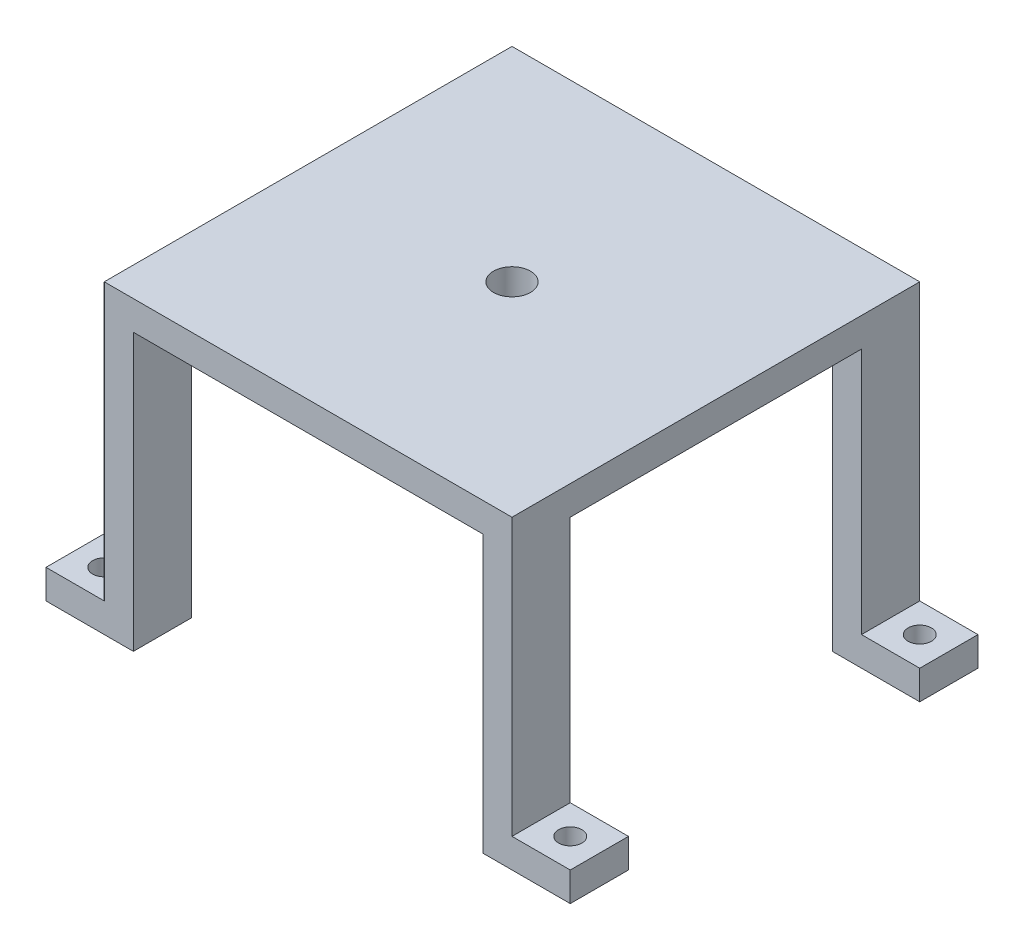
ISO-10303-21;
HEADER;
FILE_DESCRIPTION(('STEP AP214'),'2;1');
FILE_NAME('part.step','',(''),(''),'','','');
FILE_SCHEMA(('AUTOMOTIVE_DESIGN { 1 0 10303 214 1 1 1 1 }'));
ENDSEC;
DATA;
#1=APPLICATION_CONTEXT('core data for automotive mechanical design processes');
#2=APPLICATION_PROTOCOL_DEFINITION('international standard','automotive_design',2000,#1);
#3=PRODUCT_CONTEXT('',#1,'mechanical');
#4=PRODUCT('Part','Part','',(#3));
#5=PRODUCT_RELATED_PRODUCT_CATEGORY('part','',(#4));
#6=PRODUCT_DEFINITION_FORMATION('','',#4);
#7=PRODUCT_DEFINITION_CONTEXT('part definition',#1,'design');
#8=PRODUCT_DEFINITION('design','',#6,#7);
#9=PRODUCT_DEFINITION_SHAPE('','',#8);
#10=(LENGTH_UNIT() NAMED_UNIT(*) SI_UNIT(.MILLI.,.METRE.));
#11=(NAMED_UNIT(*) PLANE_ANGLE_UNIT() SI_UNIT($,.RADIAN.));
#12=(NAMED_UNIT(*) SI_UNIT($,.STERADIAN.) SOLID_ANGLE_UNIT());
#13=UNCERTAINTY_MEASURE_WITH_UNIT(LENGTH_MEASURE(1.E-05),#10,'distance_accuracy_value','');
#14=(GEOMETRIC_REPRESENTATION_CONTEXT(3) GLOBAL_UNCERTAINTY_ASSIGNED_CONTEXT((#13)) GLOBAL_UNIT_ASSIGNED_CONTEXT((#10,
#11,#12)) REPRESENTATION_CONTEXT('',''));
#15=CARTESIAN_POINT('',(0.,0.,0.));
#16=DIRECTION('',(0.,0.,1.));
#17=DIRECTION('',(1.,0.,0.));
#18=AXIS2_PLACEMENT_3D('',#15,#16,#17);
#19=CARTESIAN_POINT('',(0.,0.,0.));
#20=DIRECTION('',(0.,-1.,0.));
#21=DIRECTION('',(0.,0.,-1.));
#22=AXIS2_PLACEMENT_3D('',#19,#20,#21);
#23=PLANE('',#22);
#24=DIRECTION('',(0.,0.,-1.));
#25=VECTOR('',#24,1.);
#26=CARTESIAN_POINT('',(30.,0.,175.039070998954));
#27=LINE('',#26,#25);
#28=CARTESIAN_POINT('',(30.,0.,35.));
#29=VERTEX_POINT('',#28);
#30=CARTESIAN_POINT('',(30.,0.,25.));
#31=VERTEX_POINT('',#30);
#32=EDGE_CURVE('E437',#29,#31,#27,.T.);
#33=ORIENTED_EDGE('',*,*,#32,.T.);
#34=DIRECTION('',(-1.,0.,0.));
#35=VECTOR('',#34,1.);
#36=CARTESIAN_POINT('',(35.,0.,25.));
#37=LINE('',#36,#35);
#38=CARTESIAN_POINT('',(45.,0.,25.));
#39=VERTEX_POINT('',#38);
#40=EDGE_CURVE('E394',#39,#31,#37,.T.);
#41=ORIENTED_EDGE('',*,*,#40,.F.);
#42=DIRECTION('',(0.,0.,-1.));
#43=VECTOR('',#42,1.);
#44=CARTESIAN_POINT('',(45.,0.,35.));
#45=LINE('',#44,#43);
#46=CARTESIAN_POINT('',(45.,0.,35.));
#47=VERTEX_POINT('',#46);
#48=EDGE_CURVE('E385',#47,#39,#45,.T.);
#49=ORIENTED_EDGE('',*,*,#48,.F.);
#50=DIRECTION('',(1.,0.,0.));
#51=VECTOR('',#50,1.);
#52=CARTESIAN_POINT('',(-35.,0.,35.));
#53=LINE('',#52,#51);
#54=EDGE_CURVE('E455',#29,#47,#53,.T.);
#55=ORIENTED_EDGE('',*,*,#54,.F.);
#56=EDGE_LOOP('',(#33,#41,#49,#55));
#57=FACE_BOUND('',#56,.T.);
#58=CARTESIAN_POINT('',(40.,0.,30.));
#59=DIRECTION('',(0.,1.,0.));
#60=DIRECTION('',(0.,0.,1.));
#61=AXIS2_PLACEMENT_3D('',#58,#59,#60);
#62=CIRCLE('',#61,2.);
#63=CARTESIAN_POINT('',(40.,0.,32.));
#64=VERTEX_POINT('',#63);
#65=EDGE_CURVE('E342',#64,#64,#62,.T.);
#66=ORIENTED_EDGE('',*,*,#65,.T.);
#67=EDGE_LOOP('',(#66));
#68=FACE_BOUND('',#67,.T.);
#69=ADVANCED_FACE('F45',(#57,#68),#23,.T.);
#70=DIRECTION('',(-1.,0.,0.));
#71=VECTOR('',#70,1.);
#72=CARTESIAN_POINT('',(-35.,0.,25.));
#73=LINE('',#72,#71);
#74=CARTESIAN_POINT('',(-30.,0.,25.));
#75=VERTEX_POINT('',#74);
#76=CARTESIAN_POINT('',(-45.,0.,25.));
#77=VERTEX_POINT('',#76);
#78=EDGE_CURVE('E358',#75,#77,#73,.T.);
#79=ORIENTED_EDGE('',*,*,#78,.F.);
#80=DIRECTION('',(0.,0.,-1.));
#81=VECTOR('',#80,1.);
#82=CARTESIAN_POINT('',(-30.,0.,175.039070998954));
#83=LINE('',#82,#81);
#84=CARTESIAN_POINT('',(-30.,0.,35.));
#85=VERTEX_POINT('',#84);
#86=EDGE_CURVE('E446',#85,#75,#83,.T.);
#87=ORIENTED_EDGE('',*,*,#86,.F.);
#88=CARTESIAN_POINT('',(-45.,0.,35.));
#89=VERTEX_POINT('',#88);
#90=EDGE_CURVE('E471',#89,#85,#53,.T.);
#91=ORIENTED_EDGE('',*,*,#90,.F.);
#92=DIRECTION('',(0.,0.,1.));
#93=VECTOR('',#92,1.);
#94=CARTESIAN_POINT('',(-45.,0.,35.));
#95=LINE('',#94,#93);
#96=EDGE_CURVE('E354',#77,#89,#95,.T.);
#97=ORIENTED_EDGE('',*,*,#96,.F.);
#98=EDGE_LOOP('',(#79,#87,#91,#97));
#99=FACE_BOUND('',#98,.T.);
#100=CARTESIAN_POINT('',(-40.,0.,30.));
#101=DIRECTION('',(0.,1.,0.));
#102=DIRECTION('',(0.,0.,-1.));
#103=AXIS2_PLACEMENT_3D('',#100,#101,#102);
#104=CIRCLE('',#103,2.);
#105=CARTESIAN_POINT('',(-40.,0.,28.));
#106=VERTEX_POINT('',#105);
#107=EDGE_CURVE('E315',#106,#106,#104,.T.);
#108=ORIENTED_EDGE('',*,*,#107,.T.);
#109=EDGE_LOOP('',(#108));
#110=FACE_BOUND('',#109,.T.);
#111=ADVANCED_FACE('F602',(#99,#110),#23,.T.);
#112=CARTESIAN_POINT('',(-30.,47.45,175.039070998954));
#113=DIRECTION('',(1.,0.,0.));
#114=DIRECTION('',(0.,1.,0.));
#115=AXIS2_PLACEMENT_3D('',#112,#113,#114);
#116=PLANE('',#115);
#117=DIRECTION('',(0.,-1.,0.));
#118=VECTOR('',#117,1.);
#119=CARTESIAN_POINT('',(-30.,47.45,25.));
#120=LINE('',#119,#118);
#121=CARTESIAN_POINT('',(-30.,47.45,25.));
#122=VERTEX_POINT('',#121);
#123=EDGE_CURVE('E252',#122,#75,#120,.T.);
#124=ORIENTED_EDGE('',*,*,#123,.F.);
#125=DIRECTION('',(0.,0.,-1.));
#126=VECTOR('',#125,1.);
#127=CARTESIAN_POINT('',(-30.,47.45,175.039070998954));
#128=LINE('',#127,#126);
#129=CARTESIAN_POINT('',(-30.,47.45,35.));
#130=VERTEX_POINT('',#129);
#131=EDGE_CURVE('E451',#130,#122,#128,.T.);
#132=ORIENTED_EDGE('',*,*,#131,.F.);
#133=DIRECTION('',(0.,1.,0.));
#134=VECTOR('',#133,1.);
#135=CARTESIAN_POINT('',(-30.,47.45,35.));
#136=LINE('',#135,#134);
#137=EDGE_CURVE('E416',#85,#130,#136,.T.);
#138=ORIENTED_EDGE('',*,*,#137,.F.);
#139=ORIENTED_EDGE('',*,*,#86,.T.);
#140=EDGE_LOOP('',(#124,#132,#138,#139));
#141=FACE_BOUND('',#140,.T.);
#142=ADVANCED_FACE('F578',(#141),#116,.T.);
#143=CARTESIAN_POINT('',(30.,0.,175.039070998954));
#144=DIRECTION('',(-1.,0.,0.));
#145=DIRECTION('',(0.,0.,1.));
#146=AXIS2_PLACEMENT_3D('',#143,#144,#145);
#147=PLANE('',#146);
#148=DIRECTION('',(0.,1.,0.));
#149=VECTOR('',#148,1.);
#150=CARTESIAN_POINT('',(30.,0.,25.));
#151=LINE('',#150,#149);
#152=CARTESIAN_POINT('',(30.,47.45,25.));
#153=VERTEX_POINT('',#152);
#154=EDGE_CURVE('E247',#31,#153,#151,.T.);
#155=ORIENTED_EDGE('',*,*,#154,.F.);
#156=ORIENTED_EDGE('',*,*,#32,.F.);
#157=DIRECTION('',(0.,-1.,0.));
#158=VECTOR('',#157,1.);
#159=CARTESIAN_POINT('',(30.,0.,35.));
#160=LINE('',#159,#158);
#161=CARTESIAN_POINT('',(30.,47.45,35.));
#162=VERTEX_POINT('',#161);
#163=EDGE_CURVE('E427',#162,#29,#160,.T.);
#164=ORIENTED_EDGE('',*,*,#163,.F.);
#165=DIRECTION('',(0.,0.,-1.));
#166=VECTOR('',#165,1.);
#167=CARTESIAN_POINT('',(30.,47.45,175.039070998954));
#168=LINE('',#167,#166);
#169=EDGE_CURVE('E441',#162,#153,#168,.T.);
#170=ORIENTED_EDGE('',*,*,#169,.T.);
#171=EDGE_LOOP('',(#155,#156,#164,#170));
#172=FACE_BOUND('',#171,.T.);
#173=ADVANCED_FACE('F545',(#172),#147,.T.);
#174=CARTESIAN_POINT('',(35.,52.45,-35.));
#175=DIRECTION('',(-1.,0.,0.));
#176=DIRECTION('',(0.,0.,1.));
#177=AXIS2_PLACEMENT_3D('',#174,#175,#176);
#178=PLANE('',#177);
#179=DIRECTION('',(0.,0.,1.));
#180=VECTOR('',#179,1.);
#181=CARTESIAN_POINT('',(35.,5.,35.));
#182=LINE('',#181,#180);
#183=CARTESIAN_POINT('',(35.,5.,25.));
#184=VERTEX_POINT('',#183);
#185=CARTESIAN_POINT('',(35.,5.,35.));
#186=VERTEX_POINT('',#185);
#187=EDGE_CURVE('E389',#184,#186,#182,.T.);
#188=ORIENTED_EDGE('',*,*,#187,.F.);
#189=DIRECTION('',(0.,-1.,0.));
#190=VECTOR('',#189,1.);
#191=CARTESIAN_POINT('',(35.,0.,25.));
#192=LINE('',#191,#190);
#193=CARTESIAN_POINT('',(35.,47.45,25.));
#194=VERTEX_POINT('',#193);
#195=EDGE_CURVE('E219',#194,#184,#192,.T.);
#196=ORIENTED_EDGE('',*,*,#195,.F.);
#197=DIRECTION('',(0.,0.,1.));
#198=VECTOR('',#197,1.);
#199=CARTESIAN_POINT('',(35.,47.45,25.));
#200=LINE('',#199,#198);
#201=CARTESIAN_POINT('',(35.,47.45,-25.));
#202=VERTEX_POINT('',#201);
#203=EDGE_CURVE('E218',#202,#194,#200,.T.);
#204=ORIENTED_EDGE('',*,*,#203,.F.);
#205=DIRECTION('',(0.,1.,0.));
#206=VECTOR('',#205,1.);
#207=CARTESIAN_POINT('',(35.,0.,-25.));
#208=LINE('',#207,#206);
#209=CARTESIAN_POINT('',(35.,5.,-25.));
#210=VERTEX_POINT('',#209);
#211=EDGE_CURVE('E208',#210,#202,#208,.T.);
#212=ORIENTED_EDGE('',*,*,#211,.F.);
#213=DIRECTION('',(0.,0.,1.));
#214=VECTOR('',#213,1.);
#215=CARTESIAN_POINT('',(35.,5.,-35.));
#216=LINE('',#215,#214);
#217=CARTESIAN_POINT('',(35.,5.,-35.));
#218=VERTEX_POINT('',#217);
#219=EDGE_CURVE('E69',#218,#210,#216,.T.);
#220=ORIENTED_EDGE('',*,*,#219,.F.);
#221=DIRECTION('',(0.,-1.,0.));
#222=VECTOR('',#221,1.);
#223=CARTESIAN_POINT('',(35.,52.45,-35.));
#224=LINE('',#223,#222);
#225=CARTESIAN_POINT('',(35.,52.45,-35.));
#226=VERTEX_POINT('',#225);
#227=EDGE_CURVE('E54',#226,#218,#224,.T.);
#228=ORIENTED_EDGE('',*,*,#227,.F.);
#229=DIRECTION('',(0.,0.,-1.));
#230=VECTOR('',#229,1.);
#231=CARTESIAN_POINT('',(35.,52.45,-35.));
#232=LINE('',#231,#230);
#233=CARTESIAN_POINT('',(35.,52.45,35.));
#234=VERTEX_POINT('',#233);
#235=EDGE_CURVE('E460',#234,#226,#232,.T.);
#236=ORIENTED_EDGE('',*,*,#235,.F.);
#237=DIRECTION('',(0.,-1.,0.));
#238=VECTOR('',#237,1.);
#239=CARTESIAN_POINT('',(35.,52.45,35.));
#240=LINE('',#239,#238);
#241=EDGE_CURVE('E11',#234,#186,#240,.T.);
#242=ORIENTED_EDGE('',*,*,#241,.T.);
#243=EDGE_LOOP('',(#188,#196,#204,#212,#220,#228,#236,#242));
#244=FACE_BOUND('',#243,.T.);
#245=ADVANCED_FACE('F234',(#244),#178,.F.);
#246=CARTESIAN_POINT('',(-35.,52.45,-35.));
#247=DIRECTION('',(1.,0.,0.));
#248=DIRECTION('',(0.,0.,-1.));
#249=AXIS2_PLACEMENT_3D('',#246,#247,#248);
#250=PLANE('',#249);
#251=DIRECTION('',(0.,0.,1.));
#252=VECTOR('',#251,1.);
#253=CARTESIAN_POINT('',(-35.,47.45,-35.));
#254=LINE('',#253,#252);
#255=CARTESIAN_POINT('',(-35.,47.45,-25.));
#256=VERTEX_POINT('',#255);
#257=CARTESIAN_POINT('',(-35.,47.45,25.));
#258=VERTEX_POINT('',#257);
#259=EDGE_CURVE('E243',#256,#258,#254,.T.);
#260=ORIENTED_EDGE('',*,*,#259,.T.);
#261=DIRECTION('',(0.,-1.,0.));
#262=VECTOR('',#261,1.);
#263=CARTESIAN_POINT('',(-35.,52.45,25.));
#264=LINE('',#263,#262);
#265=CARTESIAN_POINT('',(-35.,5.,25.));
#266=VERTEX_POINT('',#265);
#267=EDGE_CURVE('E248',#258,#266,#264,.T.);
#268=ORIENTED_EDGE('',*,*,#267,.T.);
#269=DIRECTION('',(0.,0.,-1.));
#270=VECTOR('',#269,1.);
#271=CARTESIAN_POINT('',(-35.,5.,35.));
#272=LINE('',#271,#270);
#273=CARTESIAN_POINT('',(-35.,5.,35.));
#274=VERTEX_POINT('',#273);
#275=EDGE_CURVE('E368',#274,#266,#272,.T.);
#276=ORIENTED_EDGE('',*,*,#275,.F.);
#277=DIRECTION('',(0.,-1.,0.));
#278=VECTOR('',#277,1.);
#279=CARTESIAN_POINT('',(-35.,52.45,35.));
#280=LINE('',#279,#278);
#281=CARTESIAN_POINT('',(-35.,52.45,35.));
#282=VERTEX_POINT('',#281);
#283=EDGE_CURVE('E470',#282,#274,#280,.T.);
#284=ORIENTED_EDGE('',*,*,#283,.F.);
#285=DIRECTION('',(0.,0.,1.));
#286=VECTOR('',#285,1.);
#287=CARTESIAN_POINT('',(-35.,52.45,-35.));
#288=LINE('',#287,#286);
#289=CARTESIAN_POINT('',(-35.,52.45,-35.));
#290=VERTEX_POINT('',#289);
#291=EDGE_CURVE('E467',#290,#282,#288,.T.);
#292=ORIENTED_EDGE('',*,*,#291,.F.);
#293=DIRECTION('',(0.,-1.,0.));
#294=VECTOR('',#293,1.);
#295=CARTESIAN_POINT('',(-35.,52.45,-35.));
#296=LINE('',#295,#294);
#297=CARTESIAN_POINT('',(-35.,5.,-35.));
#298=VERTEX_POINT('',#297);
#299=EDGE_CURVE('E482',#290,#298,#296,.T.);
#300=ORIENTED_EDGE('',*,*,#299,.T.);
#301=DIRECTION('',(0.,0.,-1.));
#302=VECTOR('',#301,1.);
#303=CARTESIAN_POINT('',(-35.,5.,-35.));
#304=LINE('',#303,#302);
#305=CARTESIAN_POINT('',(-35.,5.,-25.));
#306=VERTEX_POINT('',#305);
#307=EDGE_CURVE('E286',#306,#298,#304,.T.);
#308=ORIENTED_EDGE('',*,*,#307,.F.);
#309=DIRECTION('',(0.,1.,0.));
#310=VECTOR('',#309,1.);
#311=CARTESIAN_POINT('',(-35.,52.45,-25.));
#312=LINE('',#311,#310);
#313=EDGE_CURVE('E251',#306,#256,#312,.T.);
#314=ORIENTED_EDGE('',*,*,#313,.T.);
#315=EDGE_LOOP('',(#260,#268,#276,#284,#292,#300,#308,#314));
#316=FACE_BOUND('',#315,.T.);
#317=ADVANCED_FACE('F561',(#316),#250,.F.);
#318=DIRECTION('',(1.,0.,0.));
#319=VECTOR('',#318,1.);
#320=CARTESIAN_POINT('',(35.,0.,-25.));
#321=LINE('',#320,#319);
#322=CARTESIAN_POINT('',(30.,0.,-25.));
#323=VERTEX_POINT('',#322);
#324=CARTESIAN_POINT('',(45.,0.,-25.));
#325=VERTEX_POINT('',#324);
#326=EDGE_CURVE('E324',#323,#325,#321,.T.);
#327=ORIENTED_EDGE('',*,*,#326,.F.);
#328=CARTESIAN_POINT('',(30.,0.,-35.));
#329=VERTEX_POINT('',#328);
#330=EDGE_CURVE('E421',#323,#329,#27,.T.);
#331=ORIENTED_EDGE('',*,*,#330,.T.);
#332=DIRECTION('',(-1.,0.,0.));
#333=VECTOR('',#332,1.);
#334=CARTESIAN_POINT('',(-35.,0.,-35.));
#335=LINE('',#334,#333);
#336=CARTESIAN_POINT('',(45.,0.,-35.));
#337=VERTEX_POINT('',#336);
#338=EDGE_CURVE('E461',#337,#329,#335,.T.);
#339=ORIENTED_EDGE('',*,*,#338,.F.);
#340=DIRECTION('',(0.,0.,-1.));
#341=VECTOR('',#340,1.);
#342=CARTESIAN_POINT('',(45.,0.,-35.));
#343=LINE('',#342,#341);
#344=EDGE_CURVE('E320',#325,#337,#343,.T.);
#345=ORIENTED_EDGE('',*,*,#344,.F.);
#346=EDGE_LOOP('',(#327,#331,#339,#345));
#347=FACE_BOUND('',#346,.T.);
#348=CARTESIAN_POINT('',(40.,0.,-30.));
#349=DIRECTION('',(0.,1.,0.));
#350=DIRECTION('',(0.,0.,-1.));
#351=AXIS2_PLACEMENT_3D('',#348,#349,#350);
#352=CIRCLE('',#351,2.);
#353=CARTESIAN_POINT('',(40.,0.,-32.));
#354=VERTEX_POINT('',#353);
#355=EDGE_CURVE('E338',#354,#354,#352,.T.);
#356=ORIENTED_EDGE('',*,*,#355,.T.);
#357=EDGE_LOOP('',(#356));
#358=FACE_BOUND('',#357,.T.);
#359=ADVANCED_FACE('F608',(#347,#358),#23,.T.);
#360=CARTESIAN_POINT('',(-35.,52.45,-35.));
#361=DIRECTION('',(0.,0.,1.));
#362=DIRECTION('',(1.,0.,0.));
#363=AXIS2_PLACEMENT_3D('',#360,#361,#362);
#364=PLANE('',#363);
#365=DIRECTION('',(0.,-1.,0.));
#366=VECTOR('',#365,1.);
#367=CARTESIAN_POINT('',(30.,0.,-35.));
#368=LINE('',#367,#366);
#369=CARTESIAN_POINT('',(30.,47.45,-35.));
#370=VERTEX_POINT('',#369);
#371=EDGE_CURVE('E423',#370,#329,#368,.T.);
#372=ORIENTED_EDGE('',*,*,#371,.F.);
#373=DIRECTION('',(1.,0.,0.));
#374=VECTOR('',#373,1.);
#375=CARTESIAN_POINT('',(30.,47.45,-35.));
#376=LINE('',#375,#374);
#377=CARTESIAN_POINT('',(-30.,47.45,-35.));
#378=VERTEX_POINT('',#377);
#379=EDGE_CURVE('E422',#378,#370,#376,.T.);
#380=ORIENTED_EDGE('',*,*,#379,.F.);
#381=DIRECTION('',(0.,1.,0.));
#382=VECTOR('',#381,1.);
#383=CARTESIAN_POINT('',(-30.,47.45,-35.));
#384=LINE('',#383,#382);
#385=CARTESIAN_POINT('',(-30.,0.,-35.));
#386=VERTEX_POINT('',#385);
#387=EDGE_CURVE('E417',#386,#378,#384,.T.);
#388=ORIENTED_EDGE('',*,*,#387,.F.);
#389=CARTESIAN_POINT('',(-45.,0.,-35.));
#390=VERTEX_POINT('',#389);
#391=EDGE_CURVE('E475',#386,#390,#335,.T.);
#392=ORIENTED_EDGE('',*,*,#391,.T.);
#393=DIRECTION('',(0.,-1.,0.));
#394=VECTOR('',#393,1.);
#395=CARTESIAN_POINT('',(-45.,5.,-35.));
#396=LINE('',#395,#394);
#397=CARTESIAN_POINT('',(-45.,5.,-35.));
#398=VERTEX_POINT('',#397);
#399=EDGE_CURVE('E272',#398,#390,#396,.T.);
#400=ORIENTED_EDGE('',*,*,#399,.F.);
#401=DIRECTION('',(-1.,0.,0.));
#402=VECTOR('',#401,1.);
#403=CARTESIAN_POINT('',(-35.,5.,-35.));
#404=LINE('',#403,#402);
#405=EDGE_CURVE('E296',#298,#398,#404,.T.);
#406=ORIENTED_EDGE('',*,*,#405,.F.);
#407=ORIENTED_EDGE('',*,*,#299,.F.);
#408=DIRECTION('',(-1.,0.,0.));
#409=VECTOR('',#408,1.);
#410=CARTESIAN_POINT('',(-35.,52.45,-35.));
#411=LINE('',#410,#409);
#412=EDGE_CURVE('E464',#226,#290,#411,.T.);
#413=ORIENTED_EDGE('',*,*,#412,.F.);
#414=ORIENTED_EDGE('',*,*,#227,.T.);
#415=DIRECTION('',(-1.,0.,0.));
#416=VECTOR('',#415,1.);
#417=CARTESIAN_POINT('',(35.,5.,-35.));
#418=LINE('',#417,#416);
#419=CARTESIAN_POINT('',(45.,5.,-35.));
#420=VERTEX_POINT('',#419);
#421=EDGE_CURVE('E325',#420,#218,#418,.T.);
#422=ORIENTED_EDGE('',*,*,#421,.F.);
#423=DIRECTION('',(0.,-1.,0.));
#424=VECTOR('',#423,1.);
#425=CARTESIAN_POINT('',(45.,5.,-35.));
#426=LINE('',#425,#424);
#427=EDGE_CURVE('E314',#420,#337,#426,.T.);
#428=ORIENTED_EDGE('',*,*,#427,.T.);
#429=ORIENTED_EDGE('',*,*,#338,.T.);
#430=EDGE_LOOP('',(#372,#380,#388,#392,#400,#406,#407,#413,#414,#422,#428,#429));
#431=FACE_BOUND('',#430,.T.);
#432=ADVANCED_FACE('F490',(#431),#364,.F.);
#433=CARTESIAN_POINT('',(-35.,52.45,35.));
#434=DIRECTION('',(0.,0.,-1.));
#435=DIRECTION('',(-1.,0.,0.));
#436=AXIS2_PLACEMENT_3D('',#433,#434,#435);
#437=PLANE('',#436);
#438=ORIENTED_EDGE('',*,*,#90,.T.);
#439=ORIENTED_EDGE('',*,*,#137,.T.);
#440=DIRECTION('',(1.,0.,0.));
#441=VECTOR('',#440,1.);
#442=CARTESIAN_POINT('',(30.,47.45,35.));
#443=LINE('',#442,#441);
#444=EDGE_CURVE('E432',#130,#162,#443,.T.);
#445=ORIENTED_EDGE('',*,*,#444,.T.);
#446=ORIENTED_EDGE('',*,*,#163,.T.);
#447=ORIENTED_EDGE('',*,*,#54,.T.);
#448=DIRECTION('',(0.,-1.,0.));
#449=VECTOR('',#448,1.);
#450=CARTESIAN_POINT('',(45.,5.,35.));
#451=LINE('',#450,#449);
#452=CARTESIAN_POINT('',(45.,5.,35.));
#453=VERTEX_POINT('',#452);
#454=EDGE_CURVE('E412',#453,#47,#451,.T.);
#455=ORIENTED_EDGE('',*,*,#454,.F.);
#456=DIRECTION('',(1.,0.,0.));
#457=VECTOR('',#456,1.);
#458=CARTESIAN_POINT('',(35.,5.,35.));
#459=LINE('',#458,#457);
#460=EDGE_CURVE('E393',#186,#453,#459,.T.);
#461=ORIENTED_EDGE('',*,*,#460,.F.);
#462=ORIENTED_EDGE('',*,*,#241,.F.);
#463=DIRECTION('',(1.,0.,0.));
#464=VECTOR('',#463,1.);
#465=CARTESIAN_POINT('',(-35.,52.45,35.));
#466=LINE('',#465,#464);
#467=EDGE_CURVE('E456',#282,#234,#466,.T.);
#468=ORIENTED_EDGE('',*,*,#467,.F.);
#469=ORIENTED_EDGE('',*,*,#283,.T.);
#470=DIRECTION('',(1.,0.,0.));
#471=VECTOR('',#470,1.);
#472=CARTESIAN_POINT('',(-35.,5.,35.));
#473=LINE('',#472,#471);
#474=CARTESIAN_POINT('',(-45.,5.,35.));
#475=VERTEX_POINT('',#474);
#476=EDGE_CURVE('E359',#475,#274,#473,.T.);
#477=ORIENTED_EDGE('',*,*,#476,.F.);
#478=DIRECTION('',(0.,-1.,0.));
#479=VECTOR('',#478,1.);
#480=CARTESIAN_POINT('',(-45.,5.,35.));
#481=LINE('',#480,#479);
#482=EDGE_CURVE('E349',#475,#89,#481,.T.);
#483=ORIENTED_EDGE('',*,*,#482,.T.);
#484=EDGE_LOOP('',(#438,#439,#445,#446,#447,#455,#461,#462,#468,#469,#477,#483));
#485=FACE_BOUND('',#484,.T.);
#486=ADVANCED_FACE('F47',(#485),#437,.F.);
#487=CARTESIAN_POINT('',(0.,52.45,0.));
#488=DIRECTION('',(0.,-1.,0.));
#489=DIRECTION('',(0.,0.,-1.));
#490=AXIS2_PLACEMENT_3D('',#487,#488,#489);
#491=PLANE('',#490);
#492=CARTESIAN_POINT('',(0.,52.45,0.));
#493=DIRECTION('',(0.,1.,0.));
#494=DIRECTION('',(0.,0.,1.));
#495=AXIS2_PLACEMENT_3D('',#492,#493,#494);
#496=CIRCLE('',#495,3.175);
#497=CARTESIAN_POINT('',(0.,52.45,3.175));
#498=VERTEX_POINT('',#497);
#499=EDGE_CURVE('E267',#498,#498,#496,.T.);
#500=ORIENTED_EDGE('',*,*,#499,.F.);
#501=EDGE_LOOP('',(#500));
#502=FACE_BOUND('',#501,.T.);
#503=ORIENTED_EDGE('',*,*,#467,.T.);
#504=ORIENTED_EDGE('',*,*,#235,.T.);
#505=ORIENTED_EDGE('',*,*,#412,.T.);
#506=ORIENTED_EDGE('',*,*,#291,.T.);
#507=EDGE_LOOP('',(#503,#504,#505,#506));
#508=FACE_BOUND('',#507,.T.);
#509=ADVANCED_FACE('F558',(#502,#508),#491,.F.);
#510=CARTESIAN_POINT('',(-30.,0.,-25.));
#511=VERTEX_POINT('',#510);
#512=EDGE_CURVE('E445',#511,#386,#83,.T.);
#513=ORIENTED_EDGE('',*,*,#512,.F.);
#514=DIRECTION('',(1.,0.,0.));
#515=VECTOR('',#514,1.);
#516=CARTESIAN_POINT('',(-35.,0.,-25.));
#517=LINE('',#516,#515);
#518=CARTESIAN_POINT('',(-45.,0.,-25.));
#519=VERTEX_POINT('',#518);
#520=EDGE_CURVE('E61',#519,#511,#517,.T.);
#521=ORIENTED_EDGE('',*,*,#520,.F.);
#522=DIRECTION('',(0.,0.,1.));
#523=VECTOR('',#522,1.);
#524=CARTESIAN_POINT('',(-45.,0.,-35.));
#525=LINE('',#524,#523);
#526=EDGE_CURVE('E285',#390,#519,#525,.T.);
#527=ORIENTED_EDGE('',*,*,#526,.F.);
#528=ORIENTED_EDGE('',*,*,#391,.F.);
#529=EDGE_LOOP('',(#513,#521,#527,#528));
#530=FACE_BOUND('',#529,.T.);
#531=CARTESIAN_POINT('',(-40.,0.,-30.));
#532=DIRECTION('',(0.,1.,0.));
#533=DIRECTION('',(0.,0.,1.));
#534=AXIS2_PLACEMENT_3D('',#531,#532,#533);
#535=CIRCLE('',#534,2.);
#536=CARTESIAN_POINT('',(-40.,0.,-28.));
#537=VERTEX_POINT('',#536);
#538=EDGE_CURVE('E302',#537,#537,#535,.T.);
#539=ORIENTED_EDGE('',*,*,#538,.T.);
#540=EDGE_LOOP('',(#539));
#541=FACE_BOUND('',#540,.T.);
#542=ADVANCED_FACE('F524',(#530,#541),#23,.T.);
#543=DIRECTION('',(0.,1.,0.));
#544=VECTOR('',#543,1.);
#545=CARTESIAN_POINT('',(-30.,47.45,-25.));
#546=LINE('',#545,#544);
#547=CARTESIAN_POINT('',(-30.,47.45,-25.));
#548=VERTEX_POINT('',#547);
#549=EDGE_CURVE('E264',#511,#548,#546,.T.);
#550=ORIENTED_EDGE('',*,*,#549,.F.);
#551=ORIENTED_EDGE('',*,*,#512,.T.);
#552=ORIENTED_EDGE('',*,*,#387,.T.);
#553=EDGE_CURVE('E450',#548,#378,#128,.T.);
#554=ORIENTED_EDGE('',*,*,#553,.F.);
#555=EDGE_LOOP('',(#550,#551,#552,#554));
#556=FACE_BOUND('',#555,.T.);
#557=ADVANCED_FACE('F515',(#556),#116,.T.);
#558=CARTESIAN_POINT('',(30.,47.45,175.039070998954));
#559=DIRECTION('',(0.,-1.,0.));
#560=DIRECTION('',(1.,0.,0.));
#561=AXIS2_PLACEMENT_3D('',#558,#559,#560);
#562=PLANE('',#561);
#563=CARTESIAN_POINT('',(30.,47.45,-25.));
#564=VERTEX_POINT('',#563);
#565=EDGE_CURVE('E229',#564,#370,#168,.T.);
#566=ORIENTED_EDGE('',*,*,#565,.F.);
#567=DIRECTION('',(1.,0.,0.));
#568=VECTOR('',#567,1.);
#569=CARTESIAN_POINT('',(-45.,47.45,-25.));
#570=LINE('',#569,#568);
#571=EDGE_CURVE('E212',#564,#202,#570,.T.);
#572=ORIENTED_EDGE('',*,*,#571,.T.);
#573=ORIENTED_EDGE('',*,*,#203,.T.);
#574=DIRECTION('',(1.,0.,0.));
#575=VECTOR('',#574,1.);
#576=CARTESIAN_POINT('',(-45.,47.45,25.));
#577=LINE('',#576,#575);
#578=EDGE_CURVE('E239',#153,#194,#577,.T.);
#579=ORIENTED_EDGE('',*,*,#578,.F.);
#580=ORIENTED_EDGE('',*,*,#169,.F.);
#581=ORIENTED_EDGE('',*,*,#444,.F.);
#582=ORIENTED_EDGE('',*,*,#131,.T.);
#583=EDGE_CURVE('E241',#258,#122,#577,.T.);
#584=ORIENTED_EDGE('',*,*,#583,.F.);
#585=ORIENTED_EDGE('',*,*,#259,.F.);
#586=EDGE_CURVE('E231',#256,#548,#570,.T.);
#587=ORIENTED_EDGE('',*,*,#586,.T.);
#588=ORIENTED_EDGE('',*,*,#553,.T.);
#589=ORIENTED_EDGE('',*,*,#379,.T.);
#590=EDGE_LOOP('',(#566,#572,#573,#579,#580,#581,#582,#584,#585,#587,#588,#589));
#591=FACE_BOUND('',#590,.T.);
#592=CARTESIAN_POINT('',(0.,47.45,0.));
#593=DIRECTION('',(0.,1.,0.));
#594=DIRECTION('',(0.,0.,1.));
#595=AXIS2_PLACEMENT_3D('',#592,#593,#594);
#596=CIRCLE('',#595,3.175);
#597=CARTESIAN_POINT('',(0.,47.45,3.175));
#598=VERTEX_POINT('',#597);
#599=EDGE_CURVE('E268',#598,#598,#596,.T.);
#600=ORIENTED_EDGE('',*,*,#599,.T.);
#601=EDGE_LOOP('',(#600));
#602=FACE_BOUND('',#601,.T.);
#603=ADVANCED_FACE('F224',(#591,#602),#562,.T.);
#604=DIRECTION('',(0.,-1.,0.));
#605=VECTOR('',#604,1.);
#606=CARTESIAN_POINT('',(30.,0.,-25.));
#607=LINE('',#606,#605);
#608=EDGE_CURVE('E261',#564,#323,#607,.T.);
#609=ORIENTED_EDGE('',*,*,#608,.F.);
#610=ORIENTED_EDGE('',*,*,#565,.T.);
#611=ORIENTED_EDGE('',*,*,#371,.T.);
#612=ORIENTED_EDGE('',*,*,#330,.F.);
#613=EDGE_LOOP('',(#609,#610,#611,#612));
#614=FACE_BOUND('',#613,.T.);
#615=ADVANCED_FACE('F504',(#614),#147,.T.);
#616=CARTESIAN_POINT('',(0.,5.,0.));
#617=DIRECTION('',(0.,-1.,0.));
#618=DIRECTION('',(0.,0.,-1.));
#619=AXIS2_PLACEMENT_3D('',#616,#617,#618);
#620=PLANE('',#619);
#621=ORIENTED_EDGE('',*,*,#307,.T.);
#622=ORIENTED_EDGE('',*,*,#405,.T.);
#623=DIRECTION('',(0.,0.,1.));
#624=VECTOR('',#623,1.);
#625=CARTESIAN_POINT('',(-45.,5.,-35.));
#626=LINE('',#625,#624);
#627=CARTESIAN_POINT('',(-45.,5.,-25.));
#628=VERTEX_POINT('',#627);
#629=EDGE_CURVE('E293',#398,#628,#626,.T.);
#630=ORIENTED_EDGE('',*,*,#629,.T.);
#631=DIRECTION('',(1.,0.,0.));
#632=VECTOR('',#631,1.);
#633=CARTESIAN_POINT('',(-35.,5.,-25.));
#634=LINE('',#633,#632);
#635=EDGE_CURVE('E282',#628,#306,#634,.T.);
#636=ORIENTED_EDGE('',*,*,#635,.T.);
#637=EDGE_LOOP('',(#621,#622,#630,#636));
#638=FACE_BOUND('',#637,.T.);
#639=CARTESIAN_POINT('',(-40.,5.,-30.));
#640=DIRECTION('',(0.,1.,0.));
#641=DIRECTION('',(0.,0.,1.));
#642=AXIS2_PLACEMENT_3D('',#639,#640,#641);
#643=CIRCLE('',#642,2.);
#644=CARTESIAN_POINT('',(-40.,5.,-28.));
#645=VERTEX_POINT('',#644);
#646=EDGE_CURVE('E289',#645,#645,#643,.T.);
#647=ORIENTED_EDGE('',*,*,#646,.F.);
#648=EDGE_LOOP('',(#647));
#649=FACE_BOUND('',#648,.T.);
#650=ADVANCED_FACE('F583',(#638,#649),#620,.F.);
#651=CARTESIAN_POINT('',(-45.,5.,-35.));
#652=DIRECTION('',(1.,0.,0.));
#653=DIRECTION('',(0.,0.,-1.));
#654=AXIS2_PLACEMENT_3D('',#651,#652,#653);
#655=PLANE('',#654);
#656=ORIENTED_EDGE('',*,*,#526,.T.);
#657=DIRECTION('',(0.,-1.,0.));
#658=VECTOR('',#657,1.);
#659=CARTESIAN_POINT('',(-45.,5.,-25.));
#660=LINE('',#659,#658);
#661=EDGE_CURVE('E279',#628,#519,#660,.T.);
#662=ORIENTED_EDGE('',*,*,#661,.F.);
#663=ORIENTED_EDGE('',*,*,#629,.F.);
#664=ORIENTED_EDGE('',*,*,#399,.T.);
#665=EDGE_LOOP('',(#656,#662,#663,#664));
#666=FACE_BOUND('',#665,.T.);
#667=ADVANCED_FACE('F588',(#666),#655,.F.);
#668=CARTESIAN_POINT('',(-35.,5.,-25.));
#669=DIRECTION('',(0.,0.,-1.));
#670=DIRECTION('',(-1.,0.,0.));
#671=AXIS2_PLACEMENT_3D('',#668,#669,#670);
#672=PLANE('',#671);
#673=ORIENTED_EDGE('',*,*,#520,.T.);
#674=ORIENTED_EDGE('',*,*,#549,.T.);
#675=ORIENTED_EDGE('',*,*,#586,.F.);
#676=ORIENTED_EDGE('',*,*,#313,.F.);
#677=ORIENTED_EDGE('',*,*,#635,.F.);
#678=ORIENTED_EDGE('',*,*,#661,.T.);
#679=EDGE_LOOP('',(#673,#674,#675,#676,#677,#678));
#680=FACE_BOUND('',#679,.T.);
#681=ADVANCED_FACE('F581',(#680),#672,.F.);
#682=CARTESIAN_POINT('',(-40.,5.,-30.));
#683=DIRECTION('',(0.,-1.,0.));
#684=DIRECTION('',(0.,0.,-1.));
#685=AXIS2_PLACEMENT_3D('',#682,#683,#684);
#686=CYLINDRICAL_SURFACE('',#685,2.);
#687=ORIENTED_EDGE('',*,*,#646,.T.);
#688=EDGE_LOOP('',(#687));
#689=FACE_BOUND('',#688,.T.);
#690=ORIENTED_EDGE('',*,*,#538,.F.);
#691=EDGE_LOOP('',(#690));
#692=FACE_BOUND('',#691,.T.);
#693=ADVANCED_FACE('F596',(#689,#692),#686,.F.);
#694=CARTESIAN_POINT('',(0.,5.,0.));
#695=DIRECTION('',(0.,-1.,0.));
#696=DIRECTION('',(0.,0.,-1.));
#697=AXIS2_PLACEMENT_3D('',#694,#695,#696);
#698=PLANE('',#697);
#699=ORIENTED_EDGE('',*,*,#476,.T.);
#700=ORIENTED_EDGE('',*,*,#275,.T.);
#701=DIRECTION('',(-1.,0.,0.));
#702=VECTOR('',#701,1.);
#703=CARTESIAN_POINT('',(-35.,5.,25.));
#704=LINE('',#703,#702);
#705=CARTESIAN_POINT('',(-45.,5.,25.));
#706=VERTEX_POINT('',#705);
#707=EDGE_CURVE('E365',#266,#706,#704,.T.);
#708=ORIENTED_EDGE('',*,*,#707,.T.);
#709=DIRECTION('',(0.,0.,1.));
#710=VECTOR('',#709,1.);
#711=CARTESIAN_POINT('',(-45.,5.,35.));
#712=LINE('',#711,#710);
#713=EDGE_CURVE('E353',#706,#475,#712,.T.);
#714=ORIENTED_EDGE('',*,*,#713,.T.);
#715=EDGE_LOOP('',(#699,#700,#708,#714));
#716=FACE_BOUND('',#715,.T.);
#717=CARTESIAN_POINT('',(-40.,5.,30.));
#718=DIRECTION('',(0.,1.,0.));
#719=DIRECTION('',(0.,0.,-1.));
#720=AXIS2_PLACEMENT_3D('',#717,#718,#719);
#721=CIRCLE('',#720,2.);
#722=CARTESIAN_POINT('',(-40.,5.,28.));
#723=VERTEX_POINT('',#722);
#724=EDGE_CURVE('E362',#723,#723,#721,.T.);
#725=ORIENTED_EDGE('',*,*,#724,.F.);
#726=EDGE_LOOP('',(#725));
#727=FACE_BOUND('',#726,.T.);
#728=ADVANCED_FACE('F564',(#716,#727),#698,.F.);
#729=CARTESIAN_POINT('',(-35.,5.,25.));
#730=DIRECTION('',(0.,0.,1.));
#731=DIRECTION('',(1.,0.,0.));
#732=AXIS2_PLACEMENT_3D('',#729,#730,#731);
#733=PLANE('',#732);
#734=ORIENTED_EDGE('',*,*,#78,.T.);
#735=DIRECTION('',(0.,-1.,0.));
#736=VECTOR('',#735,1.);
#737=CARTESIAN_POINT('',(-45.,5.,25.));
#738=LINE('',#737,#736);
#739=EDGE_CURVE('E306',#706,#77,#738,.T.);
#740=ORIENTED_EDGE('',*,*,#739,.F.);
#741=ORIENTED_EDGE('',*,*,#707,.F.);
#742=ORIENTED_EDGE('',*,*,#267,.F.);
#743=ORIENTED_EDGE('',*,*,#583,.T.);
#744=ORIENTED_EDGE('',*,*,#123,.T.);
#745=EDGE_LOOP('',(#734,#740,#741,#742,#743,#744));
#746=FACE_BOUND('',#745,.T.);
#747=ADVANCED_FACE('F568',(#746),#733,.F.);
#748=CARTESIAN_POINT('',(-45.,5.,35.));
#749=DIRECTION('',(1.,0.,0.));
#750=DIRECTION('',(0.,0.,-1.));
#751=AXIS2_PLACEMENT_3D('',#748,#749,#750);
#752=PLANE('',#751);
#753=ORIENTED_EDGE('',*,*,#96,.T.);
#754=ORIENTED_EDGE('',*,*,#482,.F.);
#755=ORIENTED_EDGE('',*,*,#713,.F.);
#756=ORIENTED_EDGE('',*,*,#739,.T.);
#757=EDGE_LOOP('',(#753,#754,#755,#756));
#758=FACE_BOUND('',#757,.T.);
#759=ADVANCED_FACE('F573',(#758),#752,.F.);
#760=CARTESIAN_POINT('',(-40.,5.,30.));
#761=DIRECTION('',(0.,-1.,0.));
#762=DIRECTION('',(0.,0.,-1.));
#763=AXIS2_PLACEMENT_3D('',#760,#761,#762);
#764=CYLINDRICAL_SURFACE('',#763,2.);
#765=ORIENTED_EDGE('',*,*,#724,.T.);
#766=EDGE_LOOP('',(#765));
#767=FACE_BOUND('',#766,.T.);
#768=ORIENTED_EDGE('',*,*,#107,.F.);
#769=EDGE_LOOP('',(#768));
#770=FACE_BOUND('',#769,.T.);
#771=ADVANCED_FACE('F643',(#767,#770),#764,.F.);
#772=CARTESIAN_POINT('',(0.,5.,0.));
#773=DIRECTION('',(0.,-1.,0.));
#774=DIRECTION('',(0.,0.,-1.));
#775=AXIS2_PLACEMENT_3D('',#772,#773,#774);
#776=PLANE('',#775);
#777=ORIENTED_EDGE('',*,*,#187,.T.);
#778=ORIENTED_EDGE('',*,*,#460,.T.);
#779=DIRECTION('',(0.,0.,-1.));
#780=VECTOR('',#779,1.);
#781=CARTESIAN_POINT('',(45.,5.,35.));
#782=LINE('',#781,#780);
#783=CARTESIAN_POINT('',(45.,5.,25.));
#784=VERTEX_POINT('',#783);
#785=EDGE_CURVE('E397',#453,#784,#782,.T.);
#786=ORIENTED_EDGE('',*,*,#785,.T.);
#787=DIRECTION('',(-1.,0.,0.));
#788=VECTOR('',#787,1.);
#789=CARTESIAN_POINT('',(35.,5.,25.));
#790=LINE('',#789,#788);
#791=EDGE_CURVE('E400',#784,#184,#790,.T.);
#792=ORIENTED_EDGE('',*,*,#791,.T.);
#793=EDGE_LOOP('',(#777,#778,#786,#792));
#794=FACE_BOUND('',#793,.T.);
#795=CARTESIAN_POINT('',(40.,5.,30.));
#796=DIRECTION('',(0.,1.,0.));
#797=DIRECTION('',(0.,0.,1.));
#798=AXIS2_PLACEMENT_3D('',#795,#796,#797);
#799=CIRCLE('',#798,2.);
#800=CARTESIAN_POINT('',(40.,5.,32.));
#801=VERTEX_POINT('',#800);
#802=EDGE_CURVE('E381',#801,#801,#799,.T.);
#803=ORIENTED_EDGE('',*,*,#802,.F.);
#804=EDGE_LOOP('',(#803));
#805=FACE_BOUND('',#804,.T.);
#806=ADVANCED_FACE('F551',(#794,#805),#776,.F.);
#807=CARTESIAN_POINT('',(45.,5.,35.));
#808=DIRECTION('',(-1.,0.,0.));
#809=DIRECTION('',(0.,0.,1.));
#810=AXIS2_PLACEMENT_3D('',#807,#808,#809);
#811=PLANE('',#810);
#812=ORIENTED_EDGE('',*,*,#48,.T.);
#813=DIRECTION('',(0.,-1.,0.));
#814=VECTOR('',#813,1.);
#815=CARTESIAN_POINT('',(45.,5.,25.));
#816=LINE('',#815,#814);
#817=EDGE_CURVE('E404',#784,#39,#816,.T.);
#818=ORIENTED_EDGE('',*,*,#817,.F.);
#819=ORIENTED_EDGE('',*,*,#785,.F.);
#820=ORIENTED_EDGE('',*,*,#454,.T.);
#821=EDGE_LOOP('',(#812,#818,#819,#820));
#822=FACE_BOUND('',#821,.T.);
#823=ADVANCED_FACE('F536',(#822),#811,.F.);
#824=CARTESIAN_POINT('',(35.,5.,25.));
#825=DIRECTION('',(0.,0.,1.));
#826=DIRECTION('',(1.,0.,0.));
#827=AXIS2_PLACEMENT_3D('',#824,#825,#826);
#828=PLANE('',#827);
#829=ORIENTED_EDGE('',*,*,#40,.T.);
#830=ORIENTED_EDGE('',*,*,#154,.T.);
#831=ORIENTED_EDGE('',*,*,#578,.T.);
#832=ORIENTED_EDGE('',*,*,#195,.T.);
#833=ORIENTED_EDGE('',*,*,#791,.F.);
#834=ORIENTED_EDGE('',*,*,#817,.T.);
#835=EDGE_LOOP('',(#829,#830,#831,#832,#833,#834));
#836=FACE_BOUND('',#835,.T.);
#837=ADVANCED_FACE('F542',(#836),#828,.F.);
#838=CARTESIAN_POINT('',(40.,5.,30.));
#839=DIRECTION('',(0.,-1.,0.));
#840=DIRECTION('',(0.,0.,-1.));
#841=AXIS2_PLACEMENT_3D('',#838,#839,#840);
#842=CYLINDRICAL_SURFACE('',#841,2.);
#843=ORIENTED_EDGE('',*,*,#802,.T.);
#844=EDGE_LOOP('',(#843));
#845=FACE_BOUND('',#844,.T.);
#846=ORIENTED_EDGE('',*,*,#65,.F.);
#847=EDGE_LOOP('',(#846));
#848=FACE_BOUND('',#847,.T.);
#849=ADVANCED_FACE('F649',(#845,#848),#842,.F.);
#850=CARTESIAN_POINT('',(0.,5.,0.));
#851=DIRECTION('',(0.,-1.,0.));
#852=DIRECTION('',(0.,0.,-1.));
#853=AXIS2_PLACEMENT_3D('',#850,#851,#852);
#854=PLANE('',#853);
#855=ORIENTED_EDGE('',*,*,#421,.T.);
#856=ORIENTED_EDGE('',*,*,#219,.T.);
#857=DIRECTION('',(1.,0.,0.));
#858=VECTOR('',#857,1.);
#859=CARTESIAN_POINT('',(35.,5.,-25.));
#860=LINE('',#859,#858);
#861=CARTESIAN_POINT('',(45.,5.,-25.));
#862=VERTEX_POINT('',#861);
#863=EDGE_CURVE('E215',#210,#862,#860,.T.);
#864=ORIENTED_EDGE('',*,*,#863,.T.);
#865=DIRECTION('',(0.,0.,-1.));
#866=VECTOR('',#865,1.);
#867=CARTESIAN_POINT('',(45.,5.,-35.));
#868=LINE('',#867,#866);
#869=EDGE_CURVE('E319',#862,#420,#868,.T.);
#870=ORIENTED_EDGE('',*,*,#869,.T.);
#871=EDGE_LOOP('',(#855,#856,#864,#870));
#872=FACE_BOUND('',#871,.T.);
#873=CARTESIAN_POINT('',(40.,5.,-30.));
#874=DIRECTION('',(0.,1.,0.));
#875=DIRECTION('',(0.,0.,-1.));
#876=AXIS2_PLACEMENT_3D('',#873,#874,#875);
#877=CIRCLE('',#876,2.);
#878=CARTESIAN_POINT('',(40.,5.,-32.));
#879=VERTEX_POINT('',#878);
#880=EDGE_CURVE('E328',#879,#879,#877,.T.);
#881=ORIENTED_EDGE('',*,*,#880,.F.);
#882=EDGE_LOOP('',(#881));
#883=FACE_BOUND('',#882,.T.);
#884=ADVANCED_FACE('F493',(#872,#883),#854,.F.);
#885=CARTESIAN_POINT('',(35.,5.,-25.));
#886=DIRECTION('',(0.,0.,-1.));
#887=DIRECTION('',(-1.,0.,0.));
#888=AXIS2_PLACEMENT_3D('',#885,#886,#887);
#889=PLANE('',#888);
#890=ORIENTED_EDGE('',*,*,#326,.T.);
#891=DIRECTION('',(0.,-1.,0.));
#892=VECTOR('',#891,1.);
#893=CARTESIAN_POINT('',(45.,5.,-25.));
#894=LINE('',#893,#892);
#895=EDGE_CURVE('E310',#862,#325,#894,.T.);
#896=ORIENTED_EDGE('',*,*,#895,.F.);
#897=ORIENTED_EDGE('',*,*,#863,.F.);
#898=ORIENTED_EDGE('',*,*,#211,.T.);
#899=ORIENTED_EDGE('',*,*,#571,.F.);
#900=ORIENTED_EDGE('',*,*,#608,.T.);
#901=EDGE_LOOP('',(#890,#896,#897,#898,#899,#900));
#902=FACE_BOUND('',#901,.T.);
#903=ADVANCED_FACE('F210',(#902),#889,.F.);
#904=CARTESIAN_POINT('',(45.,5.,-35.));
#905=DIRECTION('',(-1.,0.,0.));
#906=DIRECTION('',(0.,0.,1.));
#907=AXIS2_PLACEMENT_3D('',#904,#905,#906);
#908=PLANE('',#907);
#909=ORIENTED_EDGE('',*,*,#344,.T.);
#910=ORIENTED_EDGE('',*,*,#427,.F.);
#911=ORIENTED_EDGE('',*,*,#869,.F.);
#912=ORIENTED_EDGE('',*,*,#895,.T.);
#913=EDGE_LOOP('',(#909,#910,#911,#912));
#914=FACE_BOUND('',#913,.T.);
#915=ADVANCED_FACE('F498',(#914),#908,.F.);
#916=CARTESIAN_POINT('',(40.,5.,-30.));
#917=DIRECTION('',(0.,-1.,0.));
#918=DIRECTION('',(0.,0.,-1.));
#919=AXIS2_PLACEMENT_3D('',#916,#917,#918);
#920=CYLINDRICAL_SURFACE('',#919,2.);
#921=ORIENTED_EDGE('',*,*,#880,.T.);
#922=EDGE_LOOP('',(#921));
#923=FACE_BOUND('',#922,.T.);
#924=ORIENTED_EDGE('',*,*,#355,.F.);
#925=EDGE_LOOP('',(#924));
#926=FACE_BOUND('',#925,.T.);
#927=ADVANCED_FACE('F627',(#923,#926),#920,.F.);
#928=CARTESIAN_POINT('',(0.,47.45,0.));
#929=DIRECTION('',(0.,1.,0.));
#930=DIRECTION('',(0.,0.,1.));
#931=AXIS2_PLACEMENT_3D('',#928,#929,#930);
#932=CYLINDRICAL_SURFACE('',#931,3.175);
#933=ORIENTED_EDGE('',*,*,#599,.F.);
#934=EDGE_LOOP('',(#933));
#935=FACE_BOUND('',#934,.T.);
#936=ORIENTED_EDGE('',*,*,#499,.T.);
#937=EDGE_LOOP('',(#936));
#938=FACE_BOUND('',#937,.T.);
#939=ADVANCED_FACE('F629',(#935,#938),#932,.F.);
#940=CLOSED_SHELL('',(#69,#111,#142,#173,#245,#317,#359,#432,#486,#509,#542,#557,#603,#615,#650,
#667,#681,#693,#728,#747,#759,#771,#806,#823,#837,#849,#884,#903,#915,#927,#939));
#941=MANIFOLD_SOLID_BREP('B2',#940);
#942=ADVANCED_BREP_SHAPE_REPRESENTATION('',(#18,#941),#14);
#943=SHAPE_DEFINITION_REPRESENTATION(#9,#942);
ENDSEC;
END-ISO-10303-21;
